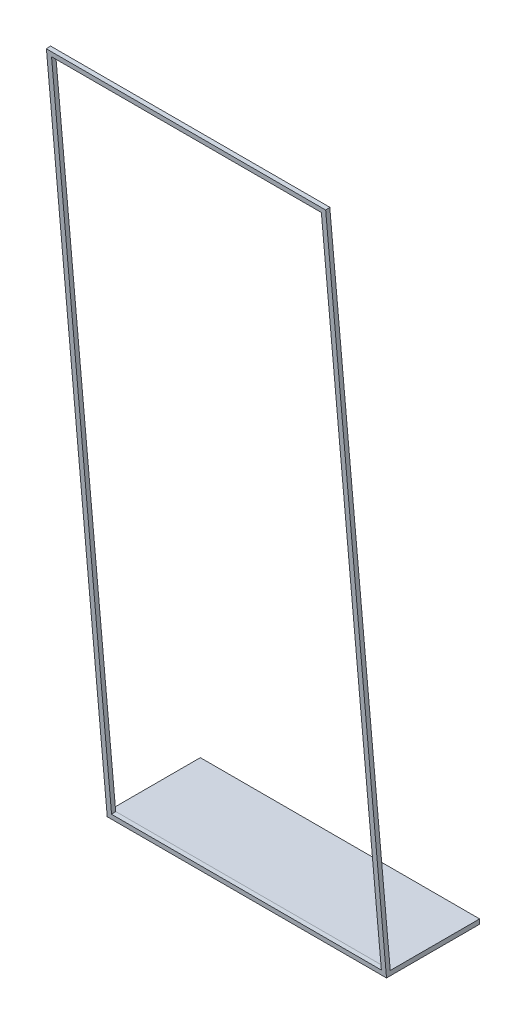
ISO-10303-21;
HEADER;
FILE_DESCRIPTION(('STEP AP214'),'2;1');
FILE_NAME('part.step','',(''),(''),'','','');
FILE_SCHEMA(('AUTOMOTIVE_DESIGN { 1 0 10303 214 1 1 1 1 }'));
ENDSEC;
DATA;
#1=APPLICATION_CONTEXT('core data for automotive mechanical design processes');
#2=APPLICATION_PROTOCOL_DEFINITION('international standard','automotive_design',2000,#1);
#3=PRODUCT_CONTEXT('',#1,'mechanical');
#4=PRODUCT('Part','Part','',(#3));
#5=PRODUCT_RELATED_PRODUCT_CATEGORY('part','',(#4));
#6=PRODUCT_DEFINITION_FORMATION('','',#4);
#7=PRODUCT_DEFINITION_CONTEXT('part definition',#1,'design');
#8=PRODUCT_DEFINITION('design','',#6,#7);
#9=PRODUCT_DEFINITION_SHAPE('','',#8);
#10=(LENGTH_UNIT() NAMED_UNIT(*) SI_UNIT(.MILLI.,.METRE.));
#11=(NAMED_UNIT(*) PLANE_ANGLE_UNIT() SI_UNIT($,.RADIAN.));
#12=(NAMED_UNIT(*) SI_UNIT($,.STERADIAN.) SOLID_ANGLE_UNIT());
#13=UNCERTAINTY_MEASURE_WITH_UNIT(LENGTH_MEASURE(1.E-05),#10,'distance_accuracy_value','');
#14=(GEOMETRIC_REPRESENTATION_CONTEXT(3) GLOBAL_UNCERTAINTY_ASSIGNED_CONTEXT((#13)) GLOBAL_UNIT_ASSIGNED_CONTEXT((#10,
#11,#12)) REPRESENTATION_CONTEXT('',''));
#15=CARTESIAN_POINT('',(0.,0.,0.));
#16=DIRECTION('',(0.,0.,1.));
#17=DIRECTION('',(1.,0.,0.));
#18=AXIS2_PLACEMENT_3D('',#15,#16,#17);
#19=CARTESIAN_POINT('',(0.,100.,0.));
#20=DIRECTION('',(0.,1.,0.));
#21=DIRECTION('',(0.,0.,1.));
#22=AXIS2_PLACEMENT_3D('',#19,#20,#21);
#23=PLANE('',#22);
#24=DIRECTION('',(0.,0.,1.));
#25=VECTOR('',#24,1.);
#26=CARTESIAN_POINT('',(-3000.,100.,-2000.));
#27=LINE('',#26,#25);
#28=CARTESIAN_POINT('',(-3000.,100.,-2000.));
#29=VERTEX_POINT('',#28);
#30=CARTESIAN_POINT('',(-3000.,100.,-80.4907172050122));
#31=VERTEX_POINT('',#30);
#32=EDGE_CURVE('E201',#29,#31,#27,.T.);
#33=ORIENTED_EDGE('',*,*,#32,.T.);
#34=DIRECTION('',(1.,0.,0.));
#35=VECTOR('',#34,1.);
#36=CARTESIAN_POINT('',(0.,100.,-80.4907172050123));
#37=LINE('',#36,#35);
#38=CARTESIAN_POINT('',(3000.,100.,-80.4907172050122));
#39=VERTEX_POINT('',#38);
#40=EDGE_CURVE('E197',#31,#39,#37,.T.);
#41=ORIENTED_EDGE('',*,*,#40,.T.);
#42=DIRECTION('',(0.,0.,-1.));
#43=VECTOR('',#42,1.);
#44=CARTESIAN_POINT('',(3000.,100.,-2000.));
#45=LINE('',#44,#43);
#46=CARTESIAN_POINT('',(3000.,100.,-2000.));
#47=VERTEX_POINT('',#46);
#48=EDGE_CURVE('E204',#39,#47,#45,.T.);
#49=ORIENTED_EDGE('',*,*,#48,.T.);
#50=DIRECTION('',(-1.,0.,0.));
#51=VECTOR('',#50,1.);
#52=CARTESIAN_POINT('',(-3000.,100.,-2000.));
#53=LINE('',#52,#51);
#54=EDGE_CURVE('E208',#47,#29,#53,.T.);
#55=ORIENTED_EDGE('',*,*,#54,.T.);
#56=EDGE_LOOP('',(#33,#41,#49,#55));
#57=FACE_BOUND('',#56,.T.);
#58=ADVANCED_FACE('F43',(#57),#23,.T.);
#59=CARTESIAN_POINT('',(-3000.,100.,-2000.));
#60=DIRECTION('',(1.,0.,0.));
#61=DIRECTION('',(0.,0.,-1.));
#62=AXIS2_PLACEMENT_3D('',#59,#60,#61);
#63=PLANE('',#62);
#64=DIRECTION('',(0.,0.,1.));
#65=VECTOR('',#64,1.);
#66=CARTESIAN_POINT('',(-3000.,0.,-2000.));
#67=LINE('',#66,#65);
#68=CARTESIAN_POINT('',(-3000.,0.,-2000.));
#69=VERTEX_POINT('',#68);
#70=CARTESIAN_POINT('',(-3000.,0.,0.));
#71=VERTEX_POINT('',#70);
#72=EDGE_CURVE('E200',#69,#71,#67,.T.);
#73=ORIENTED_EDGE('',*,*,#72,.T.);
#74=DIRECTION('',(0.,-0.996194698091746,-0.0871557427476516));
#75=VECTOR('',#74,1.);
#76=CARTESIAN_POINT('',(-3000.,0.,0.));
#77=LINE('',#76,#75);
#78=CARTESIAN_POINT('',(-3000.,14942.9204713762,1307.33614121477));
#79=VERTEX_POINT('',#78);
#80=EDGE_CURVE('E176',#79,#71,#77,.T.);
#81=ORIENTED_EDGE('',*,*,#80,.F.);
#82=DIRECTION('',(0.,-0.0871557427476531,0.996194698091746));
#83=VECTOR('',#82,1.);
#84=CARTESIAN_POINT('',(-3000.,14942.9204713762,1307.33614121477));
#85=LINE('',#84,#83);
#86=CARTESIAN_POINT('',(-3000.,14950.6686169065,1218.77443255442));
#87=VERTEX_POINT('',#86);
#88=EDGE_CURVE('E172',#87,#79,#85,.T.);
#89=ORIENTED_EDGE('',*,*,#88,.F.);
#90=DIRECTION('',(0.,0.996194698091746,0.0871557427476516));
#91=VECTOR('',#90,1.);
#92=CARTESIAN_POINT('',(-3000.,14950.6686169065,1218.77443255442));
#93=LINE('',#92,#91);
#94=EDGE_CURVE('E169',#31,#87,#93,.T.);
#95=ORIENTED_EDGE('',*,*,#94,.F.);
#96=ORIENTED_EDGE('',*,*,#32,.F.);
#97=DIRECTION('',(0.,-1.,0.));
#98=VECTOR('',#97,1.);
#99=CARTESIAN_POINT('',(-3000.,100.,-2000.));
#100=LINE('',#99,#98);
#101=EDGE_CURVE('E52',#29,#69,#100,.T.);
#102=ORIENTED_EDGE('',*,*,#101,.T.);
#103=EDGE_LOOP('',(#73,#81,#89,#95,#96,#102));
#104=FACE_BOUND('',#103,.T.);
#105=ADVANCED_FACE('F45',(#104),#63,.F.);
#106=CARTESIAN_POINT('',(3000.,100.,-2000.));
#107=DIRECTION('',(-1.,0.,0.));
#108=DIRECTION('',(0.,0.,1.));
#109=AXIS2_PLACEMENT_3D('',#106,#107,#108);
#110=PLANE('',#109);
#111=DIRECTION('',(0.,-0.996194698091746,-0.0871557427476516));
#112=VECTOR('',#111,1.);
#113=CARTESIAN_POINT('',(3000.,0.,0.));
#114=LINE('',#113,#112);
#115=CARTESIAN_POINT('',(3000.,14942.9204713762,1307.33614121477));
#116=VERTEX_POINT('',#115);
#117=CARTESIAN_POINT('',(3000.,0.,0.));
#118=VERTEX_POINT('',#117);
#119=EDGE_CURVE('E186',#116,#118,#114,.T.);
#120=ORIENTED_EDGE('',*,*,#119,.T.);
#121=DIRECTION('',(0.,0.,-1.));
#122=VECTOR('',#121,1.);
#123=CARTESIAN_POINT('',(3000.,0.,-2000.));
#124=LINE('',#123,#122);
#125=CARTESIAN_POINT('',(3000.,0.,-2000.));
#126=VERTEX_POINT('',#125);
#127=EDGE_CURVE('E217',#118,#126,#124,.T.);
#128=ORIENTED_EDGE('',*,*,#127,.T.);
#129=DIRECTION('',(0.,-1.,0.));
#130=VECTOR('',#129,1.);
#131=CARTESIAN_POINT('',(3000.,100.,-2000.));
#132=LINE('',#131,#130);
#133=EDGE_CURVE('E11',#47,#126,#132,.T.);
#134=ORIENTED_EDGE('',*,*,#133,.F.);
#135=ORIENTED_EDGE('',*,*,#48,.F.);
#136=DIRECTION('',(0.,0.996194698091746,0.0871557427476516));
#137=VECTOR('',#136,1.);
#138=CARTESIAN_POINT('',(3000.,14950.6686169065,1218.77443255442));
#139=LINE('',#138,#137);
#140=CARTESIAN_POINT('',(3000.,14950.6686169065,1218.77443255442));
#141=VERTEX_POINT('',#140);
#142=EDGE_CURVE('E180',#39,#141,#139,.T.);
#143=ORIENTED_EDGE('',*,*,#142,.T.);
#144=DIRECTION('',(0.,-0.0871557427476531,0.996194698091746));
#145=VECTOR('',#144,1.);
#146=CARTESIAN_POINT('',(3000.,14942.9204713762,1307.33614121477));
#147=LINE('',#146,#145);
#148=EDGE_CURVE('E183',#141,#116,#147,.T.);
#149=ORIENTED_EDGE('',*,*,#148,.T.);
#150=EDGE_LOOP('',(#120,#128,#134,#135,#143,#149));
#151=FACE_BOUND('',#150,.T.);
#152=ADVANCED_FACE('F250',(#151),#110,.F.);
#153=CARTESIAN_POINT('',(-3000.,100.,-2000.));
#154=DIRECTION('',(0.,0.,1.));
#155=DIRECTION('',(1.,0.,0.));
#156=AXIS2_PLACEMENT_3D('',#153,#154,#155);
#157=PLANE('',#156);
#158=DIRECTION('',(-1.,0.,0.));
#159=VECTOR('',#158,1.);
#160=CARTESIAN_POINT('',(-3000.,0.,-2000.));
#161=LINE('',#160,#159);
#162=EDGE_CURVE('E205',#126,#69,#161,.T.);
#163=ORIENTED_EDGE('',*,*,#162,.T.);
#164=ORIENTED_EDGE('',*,*,#101,.F.);
#165=ORIENTED_EDGE('',*,*,#54,.F.);
#166=ORIENTED_EDGE('',*,*,#133,.T.);
#167=EDGE_LOOP('',(#163,#164,#165,#166));
#168=FACE_BOUND('',#167,.T.);
#169=ADVANCED_FACE('F251',(#168),#157,.F.);
#170=CARTESIAN_POINT('',(0.,0.,0.));
#171=DIRECTION('',(0.,1.,0.));
#172=DIRECTION('',(0.,0.,1.));
#173=AXIS2_PLACEMENT_3D('',#170,#171,#172);
#174=PLANE('',#173);
#175=DIRECTION('',(1.,0.,0.));
#176=VECTOR('',#175,1.);
#177=CARTESIAN_POINT('',(-3000.,0.,0.));
#178=LINE('',#177,#176);
#179=EDGE_CURVE('E213',#71,#118,#178,.T.);
#180=ORIENTED_EDGE('',*,*,#179,.F.);
#181=ORIENTED_EDGE('',*,*,#72,.F.);
#182=ORIENTED_EDGE('',*,*,#162,.F.);
#183=ORIENTED_EDGE('',*,*,#127,.F.);
#184=EDGE_LOOP('',(#180,#181,#182,#183));
#185=FACE_BOUND('',#184,.T.);
#186=ADVANCED_FACE('F234',(#185),#174,.F.);
#187=CARTESIAN_POINT('',(3000.,14950.6686169065,1218.77443255442));
#188=DIRECTION('',(0.,-0.0871557427476516,0.996194698091746));
#189=DIRECTION('',(0.,-0.996194698091746,-0.0871557427476516));
#190=AXIS2_PLACEMENT_3D('',#187,#188,#189);
#191=PLANE('',#190);
#192=DIRECTION('',(-1.,0.,0.));
#193=VECTOR('',#192,1.);
#194=CARTESIAN_POINT('',(3000.,14849.4552355803,1209.91940909126));
#195=LINE('',#194,#193);
#196=CARTESIAN_POINT('',(2898.4,14849.4552355803,1209.91940909126));
#197=VERTEX_POINT('',#196);
#198=CARTESIAN_POINT('',(-2898.4,14849.4552355803,1209.91940909126));
#199=VERTEX_POINT('',#198);
#200=EDGE_CURVE('E161',#197,#199,#195,.T.);
#201=ORIENTED_EDGE('',*,*,#200,.T.);
#202=DIRECTION('',(0.,-0.996194698091746,-0.0871557427476516));
#203=VECTOR('',#202,1.);
#204=CARTESIAN_POINT('',(-2898.4,14950.6686169065,1218.77443255442));
#205=LINE('',#204,#203);
#206=CARTESIAN_POINT('',(-2898.4,108.961526856394,-79.7066851971953));
#207=VERTEX_POINT('',#206);
#208=EDGE_CURVE('E165',#199,#207,#205,.T.);
#209=ORIENTED_EDGE('',*,*,#208,.T.);
#210=DIRECTION('',(1.,0.,0.));
#211=VECTOR('',#210,1.);
#212=CARTESIAN_POINT('',(3000.,108.961526856394,-79.7066851971948));
#213=LINE('',#212,#211);
#214=CARTESIAN_POINT('',(2898.4,108.961526856394,-79.7066851971948));
#215=VERTEX_POINT('',#214);
#216=EDGE_CURVE('E152',#207,#215,#213,.T.);
#217=ORIENTED_EDGE('',*,*,#216,.T.);
#218=DIRECTION('',(0.,0.996194698091746,0.0871557427476516));
#219=VECTOR('',#218,1.);
#220=CARTESIAN_POINT('',(2898.4,14950.6686169065,1218.77443255442));
#221=LINE('',#220,#219);
#222=EDGE_CURVE('E127',#215,#197,#221,.T.);
#223=ORIENTED_EDGE('',*,*,#222,.T.);
#224=EDGE_LOOP('',(#201,#209,#217,#223));
#225=FACE_BOUND('',#224,.T.);
#226=ORIENTED_EDGE('',*,*,#40,.F.);
#227=ORIENTED_EDGE('',*,*,#94,.T.);
#228=DIRECTION('',(-1.,0.,0.));
#229=VECTOR('',#228,1.);
#230=CARTESIAN_POINT('',(3000.,14950.6686169065,1218.77443255442));
#231=LINE('',#230,#229);
#232=EDGE_CURVE('E193',#141,#87,#231,.T.);
#233=ORIENTED_EDGE('',*,*,#232,.F.);
#234=ORIENTED_EDGE('',*,*,#142,.F.);
#235=EDGE_LOOP('',(#226,#227,#233,#234));
#236=FACE_BOUND('',#235,.T.);
#237=ADVANCED_FACE('F245',(#225,#236),#191,.F.);
#238=CARTESIAN_POINT('',(3000.,14942.9204713762,1307.33614121477));
#239=DIRECTION('',(0.,-0.996194698091746,-0.0871557427476531));
#240=DIRECTION('',(0.,0.0871557427476531,-0.996194698091746));
#241=AXIS2_PLACEMENT_3D('',#238,#239,#240);
#242=PLANE('',#241);
#243=ORIENTED_EDGE('',*,*,#232,.T.);
#244=ORIENTED_EDGE('',*,*,#88,.T.);
#245=DIRECTION('',(-1.,0.,0.));
#246=VECTOR('',#245,1.);
#247=CARTESIAN_POINT('',(3000.,14942.9204713762,1307.33614121477));
#248=LINE('',#247,#246);
#249=EDGE_CURVE('E190',#116,#79,#248,.T.);
#250=ORIENTED_EDGE('',*,*,#249,.F.);
#251=ORIENTED_EDGE('',*,*,#148,.F.);
#252=EDGE_LOOP('',(#243,#244,#250,#251));
#253=FACE_BOUND('',#252,.T.);
#254=ADVANCED_FACE('F239',(#253),#242,.F.);
#255=CARTESIAN_POINT('',(3000.,0.,0.));
#256=DIRECTION('',(0.,0.0871557427476516,-0.996194698091746));
#257=DIRECTION('',(0.,0.996194698091746,0.0871557427476516));
#258=AXIS2_PLACEMENT_3D('',#255,#256,#257);
#259=PLANE('',#258);
#260=DIRECTION('',(1.,0.,0.));
#261=VECTOR('',#260,1.);
#262=CARTESIAN_POINT('',(-2898.4,101.213381326128,8.85502346316197));
#263=LINE('',#262,#261);
#264=CARTESIAN_POINT('',(-2898.4,101.213381326128,8.85502346316197));
#265=VERTEX_POINT('',#264);
#266=CARTESIAN_POINT('',(2898.4,101.213381326128,8.85502346316197));
#267=VERTEX_POINT('',#266);
#268=EDGE_CURVE('E134',#265,#267,#263,.T.);
#269=ORIENTED_EDGE('',*,*,#268,.F.);
#270=DIRECTION('',(0.,-0.996194698091746,-0.0871557427476516));
#271=VECTOR('',#270,1.);
#272=CARTESIAN_POINT('',(-2898.4,14841.7070900501,1298.48111775161));
#273=LINE('',#272,#271);
#274=CARTESIAN_POINT('',(-2898.4,14841.7070900501,1298.48111775161));
#275=VERTEX_POINT('',#274);
#276=EDGE_CURVE('E67',#275,#265,#273,.T.);
#277=ORIENTED_EDGE('',*,*,#276,.F.);
#278=DIRECTION('',(-1.,0.,0.));
#279=VECTOR('',#278,1.);
#280=CARTESIAN_POINT('',(-2898.4,14841.7070900501,1298.48111775161));
#281=LINE('',#280,#279);
#282=CARTESIAN_POINT('',(2898.4,14841.7070900501,1298.48111775161));
#283=VERTEX_POINT('',#282);
#284=EDGE_CURVE('E142',#283,#275,#281,.T.);
#285=ORIENTED_EDGE('',*,*,#284,.F.);
#286=DIRECTION('',(0.,0.996194698091746,0.0871557427476516));
#287=VECTOR('',#286,1.);
#288=CARTESIAN_POINT('',(2898.4,14841.7070900501,1298.48111775161));
#289=LINE('',#288,#287);
#290=EDGE_CURVE('E124',#267,#283,#289,.T.);
#291=ORIENTED_EDGE('',*,*,#290,.F.);
#292=EDGE_LOOP('',(#269,#277,#285,#291));
#293=FACE_BOUND('',#292,.T.);
#294=ORIENTED_EDGE('',*,*,#249,.T.);
#295=ORIENTED_EDGE('',*,*,#80,.T.);
#296=ORIENTED_EDGE('',*,*,#179,.T.);
#297=ORIENTED_EDGE('',*,*,#119,.F.);
#298=EDGE_LOOP('',(#294,#295,#296,#297));
#299=FACE_BOUND('',#298,.T.);
#300=ADVANCED_FACE('F139',(#293,#299),#259,.F.);
#301=CARTESIAN_POINT('',(-2898.4,15128.9223928473,-1984.40481537449));
#302=DIRECTION('',(-1.,0.,0.));
#303=DIRECTION('',(0.,-1.,0.));
#304=AXIS2_PLACEMENT_3D('',#301,#302,#303);
#305=PLANE('',#304);
#306=DIRECTION('',(0.,-0.0871557427476516,0.996194698091746));
#307=VECTOR('',#306,1.);
#308=CARTESIAN_POINT('',(-2898.4,15128.9223928473,-1984.40481537449));
#309=LINE('',#308,#307);
#310=EDGE_CURVE('E149',#199,#275,#309,.T.);
#311=ORIENTED_EDGE('',*,*,#310,.T.);
#312=ORIENTED_EDGE('',*,*,#276,.T.);
#313=DIRECTION('',(0.,-0.0871557427476516,0.996194698091746));
#314=VECTOR('',#313,1.);
#315=CARTESIAN_POINT('',(-2898.4,388.428684123364,-3274.03090966294));
#316=LINE('',#315,#314);
#317=EDGE_CURVE('E131',#207,#265,#316,.T.);
#318=ORIENTED_EDGE('',*,*,#317,.F.);
#319=ORIENTED_EDGE('',*,*,#208,.F.);
#320=EDGE_LOOP('',(#311,#312,#318,#319));
#321=FACE_BOUND('',#320,.T.);
#322=ADVANCED_FACE('F272',(#321),#305,.F.);
#323=CARTESIAN_POINT('',(-2898.4,15128.9223928473,-1984.40481537449));
#324=DIRECTION('',(0.,0.996194698091746,0.0871557427476515));
#325=DIRECTION('',(0.,-0.0871557427476516,0.996194698091746));
#326=AXIS2_PLACEMENT_3D('',#323,#324,#325);
#327=PLANE('',#326);
#328=DIRECTION('',(0.,-0.0871557427476516,0.996194698091746));
#329=VECTOR('',#328,1.);
#330=CARTESIAN_POINT('',(2898.4,15128.9223928473,-1984.40481537449));
#331=LINE('',#330,#329);
#332=EDGE_CURVE('E130',#197,#283,#331,.T.);
#333=ORIENTED_EDGE('',*,*,#332,.T.);
#334=ORIENTED_EDGE('',*,*,#284,.T.);
#335=ORIENTED_EDGE('',*,*,#310,.F.);
#336=ORIENTED_EDGE('',*,*,#200,.F.);
#337=EDGE_LOOP('',(#333,#334,#335,#336));
#338=FACE_BOUND('',#337,.T.);
#339=ADVANCED_FACE('F275',(#338),#327,.F.);
#340=CARTESIAN_POINT('',(2898.4,15128.9223928473,-1984.40481537449));
#341=DIRECTION('',(1.,0.,0.));
#342=DIRECTION('',(0.,1.,0.));
#343=AXIS2_PLACEMENT_3D('',#340,#341,#342);
#344=PLANE('',#343);
#345=DIRECTION('',(0.,-0.0871557427476516,0.996194698091746));
#346=VECTOR('',#345,1.);
#347=CARTESIAN_POINT('',(2898.4,388.428684123364,-3274.03090966294));
#348=LINE('',#347,#346);
#349=EDGE_CURVE('E59',#215,#267,#348,.T.);
#350=ORIENTED_EDGE('',*,*,#349,.T.);
#351=ORIENTED_EDGE('',*,*,#290,.T.);
#352=ORIENTED_EDGE('',*,*,#332,.F.);
#353=ORIENTED_EDGE('',*,*,#222,.F.);
#354=EDGE_LOOP('',(#350,#351,#352,#353));
#355=FACE_BOUND('',#354,.T.);
#356=ADVANCED_FACE('F121',(#355),#344,.F.);
#357=CARTESIAN_POINT('',(-2898.4,388.428684123364,-3274.03090966294));
#358=DIRECTION('',(0.,-0.996194698091746,-0.0871557427476515));
#359=DIRECTION('',(0.,0.0871557427476516,-0.996194698091746));
#360=AXIS2_PLACEMENT_3D('',#357,#358,#359);
#361=PLANE('',#360);
#362=ORIENTED_EDGE('',*,*,#317,.T.);
#363=ORIENTED_EDGE('',*,*,#268,.T.);
#364=ORIENTED_EDGE('',*,*,#349,.F.);
#365=ORIENTED_EDGE('',*,*,#216,.F.);
#366=EDGE_LOOP('',(#362,#363,#364,#365));
#367=FACE_BOUND('',#366,.T.);
#368=ADVANCED_FACE('F135',(#367),#361,.F.);
#369=CLOSED_SHELL('',(#58,#105,#152,#169,#186,#237,#254,#300,#322,#339,#356,#368));
#370=MANIFOLD_SOLID_BREP('B2',#369);
#371=ADVANCED_BREP_SHAPE_REPRESENTATION('',(#18,#370),#14);
#372=SHAPE_DEFINITION_REPRESENTATION(#9,#371);
ENDSEC;
END-ISO-10303-21;
